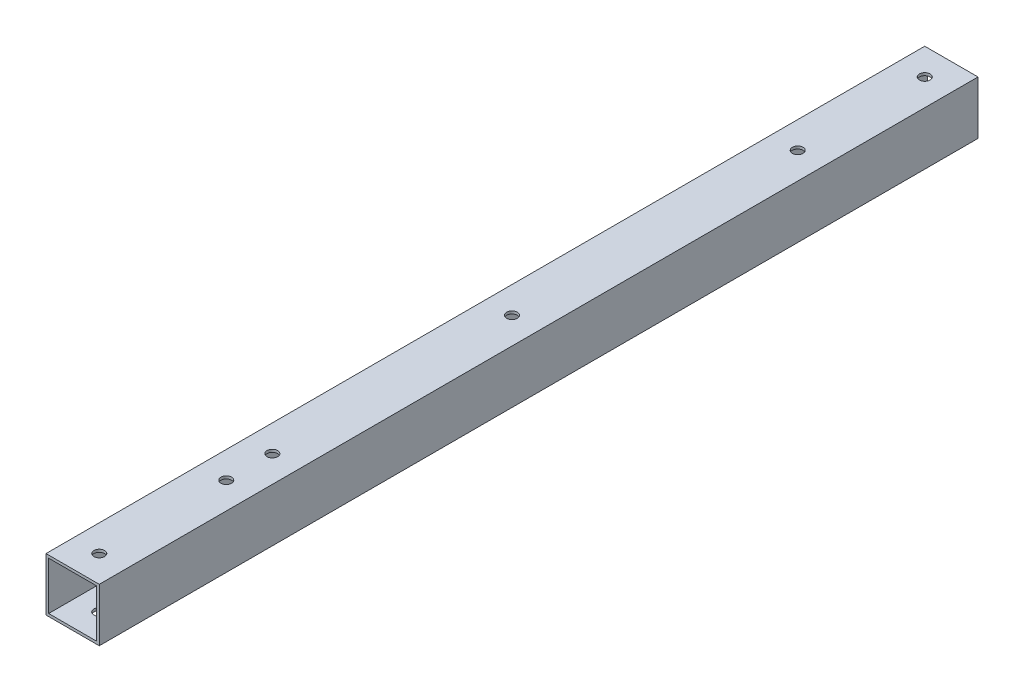
ISO-10303-21;
HEADER;
FILE_DESCRIPTION(('STEP AP214'),'2;1');
FILE_NAME('part.step','',(''),(''),'','','');
FILE_SCHEMA(('AUTOMOTIVE_DESIGN { 1 0 10303 214 1 1 1 1 }'));
ENDSEC;
DATA;
#1=APPLICATION_CONTEXT('core data for automotive mechanical design processes');
#2=APPLICATION_PROTOCOL_DEFINITION('international standard','automotive_design',2000,#1);
#3=PRODUCT_CONTEXT('',#1,'mechanical');
#4=PRODUCT('Part','Part','',(#3));
#5=PRODUCT_RELATED_PRODUCT_CATEGORY('part','',(#4));
#6=PRODUCT_DEFINITION_FORMATION('','',#4);
#7=PRODUCT_DEFINITION_CONTEXT('part definition',#1,'design');
#8=PRODUCT_DEFINITION('design','',#6,#7);
#9=PRODUCT_DEFINITION_SHAPE('','',#8);
#10=(LENGTH_UNIT() NAMED_UNIT(*) SI_UNIT(.MILLI.,.METRE.));
#11=(NAMED_UNIT(*) PLANE_ANGLE_UNIT() SI_UNIT($,.RADIAN.));
#12=(NAMED_UNIT(*) SI_UNIT($,.STERADIAN.) SOLID_ANGLE_UNIT());
#13=UNCERTAINTY_MEASURE_WITH_UNIT(LENGTH_MEASURE(1.E-05),#10,'distance_accuracy_value','');
#14=(GEOMETRIC_REPRESENTATION_CONTEXT(3) GLOBAL_UNCERTAINTY_ASSIGNED_CONTEXT((#13)) GLOBAL_UNIT_ASSIGNED_CONTEXT((#10,
#11,#12)) REPRESENTATION_CONTEXT('',''));
#15=CARTESIAN_POINT('',(0.,0.,0.));
#16=DIRECTION('',(0.,0.,1.));
#17=DIRECTION('',(1.,0.,0.));
#18=AXIS2_PLACEMENT_3D('',#15,#16,#17);
#19=CARTESIAN_POINT('',(0.,0.,165.));
#20=DIRECTION('',(0.,0.,1.));
#21=DIRECTION('',(1.,0.,0.));
#22=AXIS2_PLACEMENT_3D('',#19,#20,#21);
#23=PLANE('',#22);
#24=DIRECTION('',(0.,1.,0.));
#25=VECTOR('',#24,1.);
#26=CARTESIAN_POINT('',(10.,10.,165.));
#27=LINE('',#26,#25);
#28=CARTESIAN_POINT('',(10.,-10.,165.));
#29=VERTEX_POINT('',#28);
#30=CARTESIAN_POINT('',(10.,10.,165.));
#31=VERTEX_POINT('',#30);
#32=EDGE_CURVE('E142',#29,#31,#27,.T.);
#33=ORIENTED_EDGE('',*,*,#32,.T.);
#34=DIRECTION('',(-1.,0.,0.));
#35=VECTOR('',#34,1.);
#36=CARTESIAN_POINT('',(-10.,10.,165.));
#37=LINE('',#36,#35);
#38=CARTESIAN_POINT('',(-10.,10.,165.));
#39=VERTEX_POINT('',#38);
#40=EDGE_CURVE('E145',#31,#39,#37,.T.);
#41=ORIENTED_EDGE('',*,*,#40,.T.);
#42=DIRECTION('',(0.,-1.,0.));
#43=VECTOR('',#42,1.);
#44=CARTESIAN_POINT('',(-10.,10.,165.));
#45=LINE('',#44,#43);
#46=CARTESIAN_POINT('',(-10.,-10.,165.));
#47=VERTEX_POINT('',#46);
#48=EDGE_CURVE('E148',#39,#47,#45,.T.);
#49=ORIENTED_EDGE('',*,*,#48,.T.);
#50=DIRECTION('',(1.,0.,0.));
#51=VECTOR('',#50,1.);
#52=CARTESIAN_POINT('',(-10.,-10.,165.));
#53=LINE('',#52,#51);
#54=EDGE_CURVE('E150',#47,#29,#53,.T.);
#55=ORIENTED_EDGE('',*,*,#54,.T.);
#56=EDGE_LOOP('',(#33,#41,#49,#55));
#57=FACE_BOUND('',#56,.T.);
#58=DIRECTION('',(-1.,0.,0.));
#59=VECTOR('',#58,1.);
#60=CARTESIAN_POINT('',(-9.00000000000001,9.00000000000001,165.));
#61=LINE('',#60,#59);
#62=CARTESIAN_POINT('',(8.99999999999999,9.00000000000001,165.));
#63=VERTEX_POINT('',#62);
#64=CARTESIAN_POINT('',(-9.00000000000001,9.00000000000001,165.));
#65=VERTEX_POINT('',#64);
#66=EDGE_CURVE('E112',#63,#65,#61,.T.);
#67=ORIENTED_EDGE('',*,*,#66,.F.);
#68=DIRECTION('',(0.,1.,0.));
#69=VECTOR('',#68,1.);
#70=CARTESIAN_POINT('',(8.99999999999999,9.00000000000001,165.));
#71=LINE('',#70,#69);
#72=CARTESIAN_POINT('',(9.,-8.99999999999999,165.));
#73=VERTEX_POINT('',#72);
#74=EDGE_CURVE('E104',#73,#63,#71,.T.);
#75=ORIENTED_EDGE('',*,*,#74,.F.);
#76=DIRECTION('',(1.,0.,0.));
#77=VECTOR('',#76,1.);
#78=CARTESIAN_POINT('',(-9.,-8.99999999999999,165.));
#79=LINE('',#78,#77);
#80=CARTESIAN_POINT('',(-9.,-8.99999999999999,165.));
#81=VERTEX_POINT('',#80);
#82=EDGE_CURVE('E126',#81,#73,#79,.T.);
#83=ORIENTED_EDGE('',*,*,#82,.F.);
#84=DIRECTION('',(0.,-1.,0.));
#85=VECTOR('',#84,1.);
#86=CARTESIAN_POINT('',(-9.00000000000001,9.00000000000001,165.));
#87=LINE('',#86,#85);
#88=EDGE_CURVE('E124',#65,#81,#87,.T.);
#89=ORIENTED_EDGE('',*,*,#88,.F.);
#90=EDGE_LOOP('',(#67,#75,#83,#89));
#91=FACE_BOUND('',#90,.T.);
#92=ADVANCED_FACE('F37',(#57,#91),#23,.T.);
#93=CARTESIAN_POINT('',(0.,0.,-165.));
#94=DIRECTION('',(0.,0.,1.));
#95=DIRECTION('',(1.,0.,0.));
#96=AXIS2_PLACEMENT_3D('',#93,#94,#95);
#97=PLANE('',#96);
#98=DIRECTION('',(0.,1.,0.));
#99=VECTOR('',#98,1.);
#100=CARTESIAN_POINT('',(10.,10.,-165.));
#101=LINE('',#100,#99);
#102=CARTESIAN_POINT('',(10.,-10.,-165.));
#103=VERTEX_POINT('',#102);
#104=CARTESIAN_POINT('',(10.,10.,-165.));
#105=VERTEX_POINT('',#104);
#106=EDGE_CURVE('E120',#103,#105,#101,.T.);
#107=ORIENTED_EDGE('',*,*,#106,.F.);
#108=DIRECTION('',(1.,0.,0.));
#109=VECTOR('',#108,1.);
#110=CARTESIAN_POINT('',(-10.,-10.,-165.));
#111=LINE('',#110,#109);
#112=CARTESIAN_POINT('',(-10.,-10.,-165.));
#113=VERTEX_POINT('',#112);
#114=EDGE_CURVE('E146',#113,#103,#111,.T.);
#115=ORIENTED_EDGE('',*,*,#114,.F.);
#116=DIRECTION('',(0.,-1.,0.));
#117=VECTOR('',#116,1.);
#118=CARTESIAN_POINT('',(-10.,10.,-165.));
#119=LINE('',#118,#117);
#120=CARTESIAN_POINT('',(-10.,10.,-165.));
#121=VERTEX_POINT('',#120);
#122=EDGE_CURVE('E157',#121,#113,#119,.T.);
#123=ORIENTED_EDGE('',*,*,#122,.F.);
#124=DIRECTION('',(-1.,0.,0.));
#125=VECTOR('',#124,1.);
#126=CARTESIAN_POINT('',(-10.,10.,-165.));
#127=LINE('',#126,#125);
#128=EDGE_CURVE('E155',#105,#121,#127,.T.);
#129=ORIENTED_EDGE('',*,*,#128,.F.);
#130=EDGE_LOOP('',(#107,#115,#123,#129));
#131=FACE_BOUND('',#130,.T.);
#132=DIRECTION('',(0.,1.,0.));
#133=VECTOR('',#132,1.);
#134=CARTESIAN_POINT('',(8.99999999999999,9.00000000000001,-165.));
#135=LINE('',#134,#133);
#136=CARTESIAN_POINT('',(9.,-8.99999999999999,-165.));
#137=VERTEX_POINT('',#136);
#138=CARTESIAN_POINT('',(8.99999999999999,9.00000000000001,-165.));
#139=VERTEX_POINT('',#138);
#140=EDGE_CURVE('E62',#137,#139,#135,.T.);
#141=ORIENTED_EDGE('',*,*,#140,.T.);
#142=DIRECTION('',(-1.,0.,0.));
#143=VECTOR('',#142,1.);
#144=CARTESIAN_POINT('',(-9.00000000000001,9.00000000000001,-165.));
#145=LINE('',#144,#143);
#146=CARTESIAN_POINT('',(-9.00000000000001,9.00000000000001,-165.));
#147=VERTEX_POINT('',#146);
#148=EDGE_CURVE('E119',#139,#147,#145,.T.);
#149=ORIENTED_EDGE('',*,*,#148,.T.);
#150=DIRECTION('',(0.,-1.,0.));
#151=VECTOR('',#150,1.);
#152=CARTESIAN_POINT('',(-9.00000000000001,9.00000000000001,-165.));
#153=LINE('',#152,#151);
#154=CARTESIAN_POINT('',(-9.,-8.99999999999999,-165.));
#155=VERTEX_POINT('',#154);
#156=EDGE_CURVE('E134',#147,#155,#153,.T.);
#157=ORIENTED_EDGE('',*,*,#156,.T.);
#158=DIRECTION('',(1.,0.,0.));
#159=VECTOR('',#158,1.);
#160=CARTESIAN_POINT('',(-9.,-8.99999999999999,-165.));
#161=LINE('',#160,#159);
#162=EDGE_CURVE('E113',#155,#137,#161,.T.);
#163=ORIENTED_EDGE('',*,*,#162,.T.);
#164=EDGE_LOOP('',(#141,#149,#157,#163));
#165=FACE_BOUND('',#164,.T.);
#166=ADVANCED_FACE('F241',(#131,#165),#97,.F.);
#167=CARTESIAN_POINT('',(10.,10.,165.));
#168=DIRECTION('',(-1.,0.,0.));
#169=DIRECTION('',(0.,-1.,0.));
#170=AXIS2_PLACEMENT_3D('',#167,#168,#169);
#171=PLANE('',#170);
#172=ORIENTED_EDGE('',*,*,#106,.T.);
#173=DIRECTION('',(0.,0.,-1.));
#174=VECTOR('',#173,1.);
#175=CARTESIAN_POINT('',(10.,10.,165.));
#176=LINE('',#175,#174);
#177=EDGE_CURVE('E11',#31,#105,#176,.T.);
#178=ORIENTED_EDGE('',*,*,#177,.F.);
#179=ORIENTED_EDGE('',*,*,#32,.F.);
#180=DIRECTION('',(0.,0.,-1.));
#181=VECTOR('',#180,1.);
#182=CARTESIAN_POINT('',(10.,-10.,165.));
#183=LINE('',#182,#181);
#184=EDGE_CURVE('E152',#29,#103,#183,.T.);
#185=ORIENTED_EDGE('',*,*,#184,.T.);
#186=EDGE_LOOP('',(#172,#178,#179,#185));
#187=FACE_BOUND('',#186,.T.);
#188=ADVANCED_FACE('F39',(#187),#171,.F.);
#189=CARTESIAN_POINT('',(-10.,10.,165.));
#190=DIRECTION('',(0.,-1.,0.));
#191=DIRECTION('',(0.,0.,-1.));
#192=AXIS2_PLACEMENT_3D('',#189,#190,#191);
#193=PLANE('',#192);
#194=CARTESIAN_POINT('',(0.,10.,90.));
#195=DIRECTION('',(0.,-1.,0.));
#196=DIRECTION('',(0.,0.,-1.));
#197=AXIS2_PLACEMENT_3D('',#194,#195,#196);
#198=CIRCLE('',#197,2.);
#199=CARTESIAN_POINT('',(0.,10.,88.));
#200=VERTEX_POINT('',#199);
#201=EDGE_CURVE('E279',#200,#200,#198,.T.);
#202=ORIENTED_EDGE('',*,*,#201,.T.);
#203=EDGE_LOOP('',(#202));
#204=FACE_BOUND('',#203,.T.);
#205=CARTESIAN_POINT('',(0.,10.,0.));
#206=DIRECTION('',(0.,-1.,0.));
#207=DIRECTION('',(0.,0.,-1.));
#208=AXIS2_PLACEMENT_3D('',#205,#206,#207);
#209=CIRCLE('',#208,2.);
#210=CARTESIAN_POINT('',(0.,10.,-2.));
#211=VERTEX_POINT('',#210);
#212=EDGE_CURVE('E179',#211,#211,#209,.T.);
#213=ORIENTED_EDGE('',*,*,#212,.T.);
#214=EDGE_LOOP('',(#213));
#215=FACE_BOUND('',#214,.T.);
#216=CARTESIAN_POINT('',(0.,10.,-155.));
#217=DIRECTION('',(0.,-1.,0.));
#218=DIRECTION('',(0.,0.,-1.));
#219=AXIS2_PLACEMENT_3D('',#216,#217,#218);
#220=CIRCLE('',#219,2.);
#221=CARTESIAN_POINT('',(0.,10.,-157.));
#222=VERTEX_POINT('',#221);
#223=EDGE_CURVE('E175',#222,#222,#220,.T.);
#224=ORIENTED_EDGE('',*,*,#223,.T.);
#225=EDGE_LOOP('',(#224));
#226=FACE_BOUND('',#225,.T.);
#227=CARTESIAN_POINT('',(0.,10.,155.));
#228=DIRECTION('',(0.,-1.,0.));
#229=DIRECTION('',(0.,0.,-1.));
#230=AXIS2_PLACEMENT_3D('',#227,#228,#229);
#231=CIRCLE('',#230,2.);
#232=CARTESIAN_POINT('',(0.,10.,153.));
#233=VERTEX_POINT('',#232);
#234=EDGE_CURVE('E204',#233,#233,#231,.T.);
#235=ORIENTED_EDGE('',*,*,#234,.T.);
#236=EDGE_LOOP('',(#235));
#237=FACE_BOUND('',#236,.T.);
#238=CARTESIAN_POINT('',(0.,10.,-107.3));
#239=DIRECTION('',(0.,-1.,0.));
#240=DIRECTION('',(0.,0.,-1.));
#241=AXIS2_PLACEMENT_3D('',#238,#239,#240);
#242=CIRCLE('',#241,2.);
#243=CARTESIAN_POINT('',(0.,10.,-109.3));
#244=VERTEX_POINT('',#243);
#245=EDGE_CURVE('E171',#244,#244,#242,.T.);
#246=ORIENTED_EDGE('',*,*,#245,.T.);
#247=EDGE_LOOP('',(#246));
#248=FACE_BOUND('',#247,.T.);
#249=CARTESIAN_POINT('',(0.,10.,107.3));
#250=DIRECTION('',(0.,-1.,0.));
#251=DIRECTION('',(0.,0.,-1.));
#252=AXIS2_PLACEMENT_3D('',#249,#250,#251);
#253=CIRCLE('',#252,2.);
#254=CARTESIAN_POINT('',(0.,10.,105.3));
#255=VERTEX_POINT('',#254);
#256=EDGE_CURVE('E223',#255,#255,#253,.T.);
#257=ORIENTED_EDGE('',*,*,#256,.T.);
#258=EDGE_LOOP('',(#257));
#259=FACE_BOUND('',#258,.T.);
#260=ORIENTED_EDGE('',*,*,#128,.T.);
#261=DIRECTION('',(0.,0.,-1.));
#262=VECTOR('',#261,1.);
#263=CARTESIAN_POINT('',(-10.,10.,165.));
#264=LINE('',#263,#262);
#265=EDGE_CURVE('E46',#39,#121,#264,.T.);
#266=ORIENTED_EDGE('',*,*,#265,.F.);
#267=ORIENTED_EDGE('',*,*,#40,.F.);
#268=ORIENTED_EDGE('',*,*,#177,.T.);
#269=EDGE_LOOP('',(#260,#266,#267,#268));
#270=FACE_BOUND('',#269,.T.);
#271=ADVANCED_FACE('F268',(#204,#215,#226,#237,#248,#259,#270),#193,.F.);
#272=CARTESIAN_POINT('',(-10.,10.,165.));
#273=DIRECTION('',(1.,0.,0.));
#274=DIRECTION('',(0.,1.,0.));
#275=AXIS2_PLACEMENT_3D('',#272,#273,#274);
#276=PLANE('',#275);
#277=ORIENTED_EDGE('',*,*,#122,.T.);
#278=DIRECTION('',(0.,0.,-1.));
#279=VECTOR('',#278,1.);
#280=CARTESIAN_POINT('',(-10.,-10.,165.));
#281=LINE('',#280,#279);
#282=EDGE_CURVE('E162',#47,#113,#281,.T.);
#283=ORIENTED_EDGE('',*,*,#282,.F.);
#284=ORIENTED_EDGE('',*,*,#48,.F.);
#285=ORIENTED_EDGE('',*,*,#265,.T.);
#286=EDGE_LOOP('',(#277,#283,#284,#285));
#287=FACE_BOUND('',#286,.T.);
#288=ADVANCED_FACE('F265',(#287),#276,.F.);
#289=CARTESIAN_POINT('',(-10.,-10.,165.));
#290=DIRECTION('',(0.,1.,0.));
#291=DIRECTION('',(0.,0.,1.));
#292=AXIS2_PLACEMENT_3D('',#289,#290,#291);
#293=PLANE('',#292);
#294=CARTESIAN_POINT('',(0.,-10.,90.));
#295=DIRECTION('',(0.,-1.,0.));
#296=DIRECTION('',(0.,0.,-1.));
#297=AXIS2_PLACEMENT_3D('',#294,#295,#296);
#298=CIRCLE('',#297,1.99999999999999);
#299=CARTESIAN_POINT('',(0.,-10.,88.));
#300=VERTEX_POINT('',#299);
#301=EDGE_CURVE('E343',#300,#300,#298,.T.);
#302=ORIENTED_EDGE('',*,*,#301,.F.);
#303=EDGE_LOOP('',(#302));
#304=FACE_BOUND('',#303,.T.);
#305=CARTESIAN_POINT('',(0.,-10.,0.));
#306=DIRECTION('',(0.,-1.,0.));
#307=DIRECTION('',(0.,0.,-1.));
#308=AXIS2_PLACEMENT_3D('',#305,#306,#307);
#309=CIRCLE('',#308,1.99999999999999);
#310=CARTESIAN_POINT('',(0.,-10.,-1.99999999999999));
#311=VERTEX_POINT('',#310);
#312=EDGE_CURVE('E186',#311,#311,#309,.T.);
#313=ORIENTED_EDGE('',*,*,#312,.F.);
#314=EDGE_LOOP('',(#313));
#315=FACE_BOUND('',#314,.T.);
#316=CARTESIAN_POINT('',(0.,-10.,-155.));
#317=DIRECTION('',(0.,-1.,0.));
#318=DIRECTION('',(0.,0.,-1.));
#319=AXIS2_PLACEMENT_3D('',#316,#317,#318);
#320=CIRCLE('',#319,2.);
#321=CARTESIAN_POINT('',(0.,-10.,-157.));
#322=VERTEX_POINT('',#321);
#323=EDGE_CURVE('E183',#322,#322,#320,.T.);
#324=ORIENTED_EDGE('',*,*,#323,.F.);
#325=EDGE_LOOP('',(#324));
#326=FACE_BOUND('',#325,.T.);
#327=CARTESIAN_POINT('',(0.,-10.,155.));
#328=DIRECTION('',(0.,-1.,0.));
#329=DIRECTION('',(0.,0.,-1.));
#330=AXIS2_PLACEMENT_3D('',#327,#328,#329);
#331=CIRCLE('',#330,2.);
#332=CARTESIAN_POINT('',(0.,-10.,153.));
#333=VERTEX_POINT('',#332);
#334=EDGE_CURVE('E201',#333,#333,#331,.T.);
#335=ORIENTED_EDGE('',*,*,#334,.F.);
#336=EDGE_LOOP('',(#335));
#337=FACE_BOUND('',#336,.T.);
#338=CARTESIAN_POINT('',(0.,-10.,-107.3));
#339=DIRECTION('',(0.,-1.,0.));
#340=DIRECTION('',(0.,0.,-1.));
#341=AXIS2_PLACEMENT_3D('',#338,#339,#340);
#342=CIRCLE('',#341,2.);
#343=CARTESIAN_POINT('',(0.,-10.,-109.3));
#344=VERTEX_POINT('',#343);
#345=EDGE_CURVE('E213',#344,#344,#342,.T.);
#346=ORIENTED_EDGE('',*,*,#345,.F.);
#347=EDGE_LOOP('',(#346));
#348=FACE_BOUND('',#347,.T.);
#349=CARTESIAN_POINT('',(0.,-10.,107.3));
#350=DIRECTION('',(0.,-1.,0.));
#351=DIRECTION('',(0.,0.,-1.));
#352=AXIS2_PLACEMENT_3D('',#349,#350,#351);
#353=CIRCLE('',#352,2.);
#354=CARTESIAN_POINT('',(0.,-10.,105.3));
#355=VERTEX_POINT('',#354);
#356=EDGE_CURVE('E220',#355,#355,#353,.T.);
#357=ORIENTED_EDGE('',*,*,#356,.F.);
#358=EDGE_LOOP('',(#357));
#359=FACE_BOUND('',#358,.T.);
#360=ORIENTED_EDGE('',*,*,#114,.T.);
#361=ORIENTED_EDGE('',*,*,#184,.F.);
#362=ORIENTED_EDGE('',*,*,#54,.F.);
#363=ORIENTED_EDGE('',*,*,#282,.T.);
#364=EDGE_LOOP('',(#360,#361,#362,#363));
#365=FACE_BOUND('',#364,.T.);
#366=ADVANCED_FACE('F262',(#304,#315,#326,#337,#348,#359,#365),#293,.F.);
#367=CARTESIAN_POINT('',(8.99999999999999,9.00000000000001,165.));
#368=DIRECTION('',(-1.,0.,0.));
#369=DIRECTION('',(0.,-1.,0.));
#370=AXIS2_PLACEMENT_3D('',#367,#368,#369);
#371=PLANE('',#370);
#372=ORIENTED_EDGE('',*,*,#140,.F.);
#373=DIRECTION('',(0.,0.,-1.));
#374=VECTOR('',#373,1.);
#375=CARTESIAN_POINT('',(9.,-8.99999999999999,165.));
#376=LINE('',#375,#374);
#377=EDGE_CURVE('E108',#73,#137,#376,.T.);
#378=ORIENTED_EDGE('',*,*,#377,.F.);
#379=ORIENTED_EDGE('',*,*,#74,.T.);
#380=DIRECTION('',(0.,0.,-1.));
#381=VECTOR('',#380,1.);
#382=CARTESIAN_POINT('',(8.99999999999999,9.00000000000001,165.));
#383=LINE('',#382,#381);
#384=EDGE_CURVE('E107',#63,#139,#383,.T.);
#385=ORIENTED_EDGE('',*,*,#384,.T.);
#386=EDGE_LOOP('',(#372,#378,#379,#385));
#387=FACE_BOUND('',#386,.T.);
#388=ADVANCED_FACE('F106',(#387),#371,.T.);
#389=CARTESIAN_POINT('',(-9.00000000000001,9.00000000000001,165.));
#390=DIRECTION('',(0.,-1.,0.));
#391=DIRECTION('',(0.,0.,-1.));
#392=AXIS2_PLACEMENT_3D('',#389,#390,#391);
#393=PLANE('',#392);
#394=CARTESIAN_POINT('',(0.,9.00000000000001,90.));
#395=DIRECTION('',(0.,-1.,0.));
#396=DIRECTION('',(0.,0.,-1.));
#397=AXIS2_PLACEMENT_3D('',#394,#395,#396);
#398=CIRCLE('',#397,1.99999999999999);
#399=CARTESIAN_POINT('',(0.,9.00000000000001,88.));
#400=VERTEX_POINT('',#399);
#401=EDGE_CURVE('E191',#400,#400,#398,.T.);
#402=ORIENTED_EDGE('',*,*,#401,.F.);
#403=EDGE_LOOP('',(#402));
#404=FACE_BOUND('',#403,.T.);
#405=CARTESIAN_POINT('',(0.,9.00000000000001,0.));
#406=DIRECTION('',(0.,-1.,0.));
#407=DIRECTION('',(0.,0.,-1.));
#408=AXIS2_PLACEMENT_3D('',#405,#406,#407);
#409=CIRCLE('',#408,1.99999999999999);
#410=CARTESIAN_POINT('',(0.,9.00000000000001,-1.99999999999999));
#411=VERTEX_POINT('',#410);
#412=EDGE_CURVE('E178',#411,#411,#409,.T.);
#413=ORIENTED_EDGE('',*,*,#412,.F.);
#414=EDGE_LOOP('',(#413));
#415=FACE_BOUND('',#414,.T.);
#416=CARTESIAN_POINT('',(0.,9.00000000000001,-155.));
#417=DIRECTION('',(0.,-1.,0.));
#418=DIRECTION('',(0.,0.,-1.));
#419=AXIS2_PLACEMENT_3D('',#416,#417,#418);
#420=CIRCLE('',#419,2.);
#421=CARTESIAN_POINT('',(0.,9.00000000000001,-157.));
#422=VERTEX_POINT('',#421);
#423=EDGE_CURVE('E174',#422,#422,#420,.T.);
#424=ORIENTED_EDGE('',*,*,#423,.F.);
#425=EDGE_LOOP('',(#424));
#426=FACE_BOUND('',#425,.T.);
#427=CARTESIAN_POINT('',(0.,9.00000000000001,155.));
#428=DIRECTION('',(0.,-1.,0.));
#429=DIRECTION('',(0.,0.,-1.));
#430=AXIS2_PLACEMENT_3D('',#427,#428,#429);
#431=CIRCLE('',#430,2.);
#432=CARTESIAN_POINT('',(0.,9.00000000000001,153.));
#433=VERTEX_POINT('',#432);
#434=EDGE_CURVE('E210',#433,#433,#431,.T.);
#435=ORIENTED_EDGE('',*,*,#434,.F.);
#436=EDGE_LOOP('',(#435));
#437=FACE_BOUND('',#436,.T.);
#438=CARTESIAN_POINT('',(0.,9.00000000000001,-107.3));
#439=DIRECTION('',(0.,-1.,0.));
#440=DIRECTION('',(0.,0.,-1.));
#441=AXIS2_PLACEMENT_3D('',#438,#439,#440);
#442=CIRCLE('',#441,2.);
#443=CARTESIAN_POINT('',(0.,9.00000000000001,-109.3));
#444=VERTEX_POINT('',#443);
#445=EDGE_CURVE('E170',#444,#444,#442,.T.);
#446=ORIENTED_EDGE('',*,*,#445,.F.);
#447=EDGE_LOOP('',(#446));
#448=FACE_BOUND('',#447,.T.);
#449=CARTESIAN_POINT('',(0.,9.00000000000001,107.3));
#450=DIRECTION('',(0.,-1.,0.));
#451=DIRECTION('',(0.,0.,-1.));
#452=AXIS2_PLACEMENT_3D('',#449,#450,#451);
#453=CIRCLE('',#452,2.);
#454=CARTESIAN_POINT('',(0.,9.00000000000001,105.3));
#455=VERTEX_POINT('',#454);
#456=EDGE_CURVE('E226',#455,#455,#453,.T.);
#457=ORIENTED_EDGE('',*,*,#456,.F.);
#458=EDGE_LOOP('',(#457));
#459=FACE_BOUND('',#458,.T.);
#460=ORIENTED_EDGE('',*,*,#148,.F.);
#461=ORIENTED_EDGE('',*,*,#384,.F.);
#462=ORIENTED_EDGE('',*,*,#66,.T.);
#463=DIRECTION('',(0.,0.,-1.));
#464=VECTOR('',#463,1.);
#465=CARTESIAN_POINT('',(-9.00000000000001,9.00000000000001,165.));
#466=LINE('',#465,#464);
#467=EDGE_CURVE('E121',#65,#147,#466,.T.);
#468=ORIENTED_EDGE('',*,*,#467,.T.);
#469=EDGE_LOOP('',(#460,#461,#462,#468));
#470=FACE_BOUND('',#469,.T.);
#471=ADVANCED_FACE('F116',(#404,#415,#426,#437,#448,#459,#470),#393,.T.);
#472=CARTESIAN_POINT('',(-9.00000000000001,9.00000000000001,165.));
#473=DIRECTION('',(1.,0.,0.));
#474=DIRECTION('',(0.,1.,0.));
#475=AXIS2_PLACEMENT_3D('',#472,#473,#474);
#476=PLANE('',#475);
#477=ORIENTED_EDGE('',*,*,#156,.F.);
#478=ORIENTED_EDGE('',*,*,#467,.F.);
#479=ORIENTED_EDGE('',*,*,#88,.T.);
#480=DIRECTION('',(0.,0.,-1.));
#481=VECTOR('',#480,1.);
#482=CARTESIAN_POINT('',(-9.,-8.99999999999999,165.));
#483=LINE('',#482,#481);
#484=EDGE_CURVE('E54',#81,#155,#483,.T.);
#485=ORIENTED_EDGE('',*,*,#484,.T.);
#486=EDGE_LOOP('',(#477,#478,#479,#485));
#487=FACE_BOUND('',#486,.T.);
#488=ADVANCED_FACE('F236',(#487),#476,.T.);
#489=CARTESIAN_POINT('',(-9.,-8.99999999999999,165.));
#490=DIRECTION('',(0.,1.,0.));
#491=DIRECTION('',(0.,0.,1.));
#492=AXIS2_PLACEMENT_3D('',#489,#490,#491);
#493=PLANE('',#492);
#494=CARTESIAN_POINT('',(0.,-8.99999999999999,90.));
#495=DIRECTION('',(0.,1.,0.));
#496=DIRECTION('',(0.,0.,1.));
#497=AXIS2_PLACEMENT_3D('',#494,#495,#496);
#498=CIRCLE('',#497,1.99999999999999);
#499=CARTESIAN_POINT('',(0.,-8.99999999999999,92.));
#500=VERTEX_POINT('',#499);
#501=EDGE_CURVE('E41',#500,#500,#498,.T.);
#502=ORIENTED_EDGE('',*,*,#501,.F.);
#503=EDGE_LOOP('',(#502));
#504=FACE_BOUND('',#503,.T.);
#505=CARTESIAN_POINT('',(0.,-8.99999999999999,0.));
#506=DIRECTION('',(0.,1.,0.));
#507=DIRECTION('',(0.,0.,1.));
#508=AXIS2_PLACEMENT_3D('',#505,#506,#507);
#509=CIRCLE('',#508,1.99999999999999);
#510=CARTESIAN_POINT('',(0.,-8.99999999999999,1.99999999999999));
#511=VERTEX_POINT('',#510);
#512=EDGE_CURVE('E176',#511,#511,#509,.T.);
#513=ORIENTED_EDGE('',*,*,#512,.F.);
#514=EDGE_LOOP('',(#513));
#515=FACE_BOUND('',#514,.T.);
#516=CARTESIAN_POINT('',(0.,-8.99999999999999,-155.));
#517=DIRECTION('',(0.,1.,0.));
#518=DIRECTION('',(0.,0.,1.));
#519=AXIS2_PLACEMENT_3D('',#516,#517,#518);
#520=CIRCLE('',#519,2.);
#521=CARTESIAN_POINT('',(0.,-8.99999999999999,-153.));
#522=VERTEX_POINT('',#521);
#523=EDGE_CURVE('E172',#522,#522,#520,.T.);
#524=ORIENTED_EDGE('',*,*,#523,.F.);
#525=EDGE_LOOP('',(#524));
#526=FACE_BOUND('',#525,.T.);
#527=CARTESIAN_POINT('',(0.,-8.99999999999999,155.));
#528=DIRECTION('',(0.,1.,0.));
#529=DIRECTION('',(0.,0.,1.));
#530=AXIS2_PLACEMENT_3D('',#527,#528,#529);
#531=CIRCLE('',#530,2.);
#532=CARTESIAN_POINT('',(0.,-8.99999999999999,157.));
#533=VERTEX_POINT('',#532);
#534=EDGE_CURVE('E207',#533,#533,#531,.T.);
#535=ORIENTED_EDGE('',*,*,#534,.F.);
#536=EDGE_LOOP('',(#535));
#537=FACE_BOUND('',#536,.T.);
#538=CARTESIAN_POINT('',(0.,-8.99999999999999,-107.3));
#539=DIRECTION('',(0.,1.,0.));
#540=DIRECTION('',(0.,0.,1.));
#541=AXIS2_PLACEMENT_3D('',#538,#539,#540);
#542=CIRCLE('',#541,2.);
#543=CARTESIAN_POINT('',(0.,-8.99999999999999,-105.3));
#544=VERTEX_POINT('',#543);
#545=EDGE_CURVE('E167',#544,#544,#542,.T.);
#546=ORIENTED_EDGE('',*,*,#545,.F.);
#547=EDGE_LOOP('',(#546));
#548=FACE_BOUND('',#547,.T.);
#549=CARTESIAN_POINT('',(0.,-8.99999999999999,107.3));
#550=DIRECTION('',(0.,1.,0.));
#551=DIRECTION('',(0.,0.,1.));
#552=AXIS2_PLACEMENT_3D('',#549,#550,#551);
#553=CIRCLE('',#552,2.);
#554=CARTESIAN_POINT('',(0.,-8.99999999999999,109.3));
#555=VERTEX_POINT('',#554);
#556=EDGE_CURVE('E132',#555,#555,#553,.T.);
#557=ORIENTED_EDGE('',*,*,#556,.F.);
#558=EDGE_LOOP('',(#557));
#559=FACE_BOUND('',#558,.T.);
#560=ORIENTED_EDGE('',*,*,#162,.F.);
#561=ORIENTED_EDGE('',*,*,#484,.F.);
#562=ORIENTED_EDGE('',*,*,#82,.T.);
#563=ORIENTED_EDGE('',*,*,#377,.T.);
#564=EDGE_LOOP('',(#560,#561,#562,#563));
#565=FACE_BOUND('',#564,.T.);
#566=ADVANCED_FACE('F234',(#504,#515,#526,#537,#548,#559,#565),#493,.T.);
#567=CARTESIAN_POINT('',(0.,-10.,107.3));
#568=DIRECTION('',(0.,-1.,0.));
#569=DIRECTION('',(0.,0.,-1.));
#570=AXIS2_PLACEMENT_3D('',#567,#568,#569);
#571=CYLINDRICAL_SURFACE('',#570,2.);
#572=ORIENTED_EDGE('',*,*,#556,.T.);
#573=EDGE_LOOP('',(#572));
#574=FACE_BOUND('',#573,.T.);
#575=ORIENTED_EDGE('',*,*,#356,.T.);
#576=EDGE_LOOP('',(#575));
#577=FACE_BOUND('',#576,.T.);
#578=ADVANCED_FACE('F231',(#574,#577),#571,.F.);
#579=ORIENTED_EDGE('',*,*,#456,.T.);
#580=EDGE_LOOP('',(#579));
#581=FACE_BOUND('',#580,.T.);
#582=ORIENTED_EDGE('',*,*,#256,.F.);
#583=EDGE_LOOP('',(#582));
#584=FACE_BOUND('',#583,.T.);
#585=ADVANCED_FACE('F301',(#581,#584),#571,.F.);
#586=CARTESIAN_POINT('',(0.,-10.,-107.3));
#587=DIRECTION('',(0.,-1.,0.));
#588=DIRECTION('',(0.,0.,-1.));
#589=AXIS2_PLACEMENT_3D('',#586,#587,#588);
#590=CYLINDRICAL_SURFACE('',#589,2.);
#591=ORIENTED_EDGE('',*,*,#545,.T.);
#592=EDGE_LOOP('',(#591));
#593=FACE_BOUND('',#592,.T.);
#594=ORIENTED_EDGE('',*,*,#345,.T.);
#595=EDGE_LOOP('',(#594));
#596=FACE_BOUND('',#595,.T.);
#597=ADVANCED_FACE('F303',(#593,#596),#590,.F.);
#598=ORIENTED_EDGE('',*,*,#445,.T.);
#599=EDGE_LOOP('',(#598));
#600=FACE_BOUND('',#599,.T.);
#601=ORIENTED_EDGE('',*,*,#245,.F.);
#602=EDGE_LOOP('',(#601));
#603=FACE_BOUND('',#602,.T.);
#604=ADVANCED_FACE('F310',(#600,#603),#590,.F.);
#605=CARTESIAN_POINT('',(0.,-10.,155.));
#606=DIRECTION('',(0.,-1.,0.));
#607=DIRECTION('',(0.,0.,-1.));
#608=AXIS2_PLACEMENT_3D('',#605,#606,#607);
#609=CYLINDRICAL_SURFACE('',#608,2.);
#610=ORIENTED_EDGE('',*,*,#434,.T.);
#611=EDGE_LOOP('',(#610));
#612=FACE_BOUND('',#611,.T.);
#613=ORIENTED_EDGE('',*,*,#234,.F.);
#614=EDGE_LOOP('',(#613));
#615=FACE_BOUND('',#614,.T.);
#616=ADVANCED_FACE('F318',(#612,#615),#609,.F.);
#617=ORIENTED_EDGE('',*,*,#534,.T.);
#618=EDGE_LOOP('',(#617));
#619=FACE_BOUND('',#618,.T.);
#620=ORIENTED_EDGE('',*,*,#334,.T.);
#621=EDGE_LOOP('',(#620));
#622=FACE_BOUND('',#621,.T.);
#623=ADVANCED_FACE('F314',(#619,#622),#609,.F.);
#624=CARTESIAN_POINT('',(0.,-10.,-155.));
#625=DIRECTION('',(0.,-1.,0.));
#626=DIRECTION('',(0.,0.,-1.));
#627=AXIS2_PLACEMENT_3D('',#624,#625,#626);
#628=CYLINDRICAL_SURFACE('',#627,2.);
#629=ORIENTED_EDGE('',*,*,#523,.T.);
#630=EDGE_LOOP('',(#629));
#631=FACE_BOUND('',#630,.T.);
#632=ORIENTED_EDGE('',*,*,#323,.T.);
#633=EDGE_LOOP('',(#632));
#634=FACE_BOUND('',#633,.T.);
#635=ADVANCED_FACE('F317',(#631,#634),#628,.F.);
#636=ORIENTED_EDGE('',*,*,#423,.T.);
#637=EDGE_LOOP('',(#636));
#638=FACE_BOUND('',#637,.T.);
#639=ORIENTED_EDGE('',*,*,#223,.F.);
#640=EDGE_LOOP('',(#639));
#641=FACE_BOUND('',#640,.T.);
#642=ADVANCED_FACE('F322',(#638,#641),#628,.F.);
#643=CARTESIAN_POINT('',(0.,-10.,0.));
#644=DIRECTION('',(0.,-1.,0.));
#645=DIRECTION('',(0.,0.,-1.));
#646=AXIS2_PLACEMENT_3D('',#643,#644,#645);
#647=CYLINDRICAL_SURFACE('',#646,1.99999999999999);
#648=ORIENTED_EDGE('',*,*,#512,.T.);
#649=EDGE_LOOP('',(#648));
#650=FACE_BOUND('',#649,.T.);
#651=ORIENTED_EDGE('',*,*,#312,.T.);
#652=EDGE_LOOP('',(#651));
#653=FACE_BOUND('',#652,.T.);
#654=ADVANCED_FACE('F324',(#650,#653),#647,.F.);
#655=ORIENTED_EDGE('',*,*,#412,.T.);
#656=EDGE_LOOP('',(#655));
#657=FACE_BOUND('',#656,.T.);
#658=ORIENTED_EDGE('',*,*,#212,.F.);
#659=EDGE_LOOP('',(#658));
#660=FACE_BOUND('',#659,.T.);
#661=ADVANCED_FACE('F327',(#657,#660),#647,.F.);
#662=CARTESIAN_POINT('',(0.,-10.,90.));
#663=DIRECTION('',(0.,-1.,0.));
#664=DIRECTION('',(0.,0.,-1.));
#665=AXIS2_PLACEMENT_3D('',#662,#663,#664);
#666=CYLINDRICAL_SURFACE('',#665,1.99999999999999);
#667=ORIENTED_EDGE('',*,*,#501,.T.);
#668=EDGE_LOOP('',(#667));
#669=FACE_BOUND('',#668,.T.);
#670=ORIENTED_EDGE('',*,*,#301,.T.);
#671=EDGE_LOOP('',(#670));
#672=FACE_BOUND('',#671,.T.);
#673=ADVANCED_FACE('F328',(#669,#672),#666,.F.);
#674=ORIENTED_EDGE('',*,*,#401,.T.);
#675=EDGE_LOOP('',(#674));
#676=FACE_BOUND('',#675,.T.);
#677=ORIENTED_EDGE('',*,*,#201,.F.);
#678=EDGE_LOOP('',(#677));
#679=FACE_BOUND('',#678,.T.);
#680=ADVANCED_FACE('F330',(#676,#679),#666,.F.);
#681=CLOSED_SHELL('',(#92,#166,#188,#271,#288,#366,#388,#471,#488,#566,#578,#585,#597,#604,#616,
#623,#635,#642,#654,#661,#673,#680));
#682=MANIFOLD_SOLID_BREP('B2',#681);
#683=ADVANCED_BREP_SHAPE_REPRESENTATION('',(#18,#682),#14);
#684=SHAPE_DEFINITION_REPRESENTATION(#9,#683);
ENDSEC;
END-ISO-10303-21;
